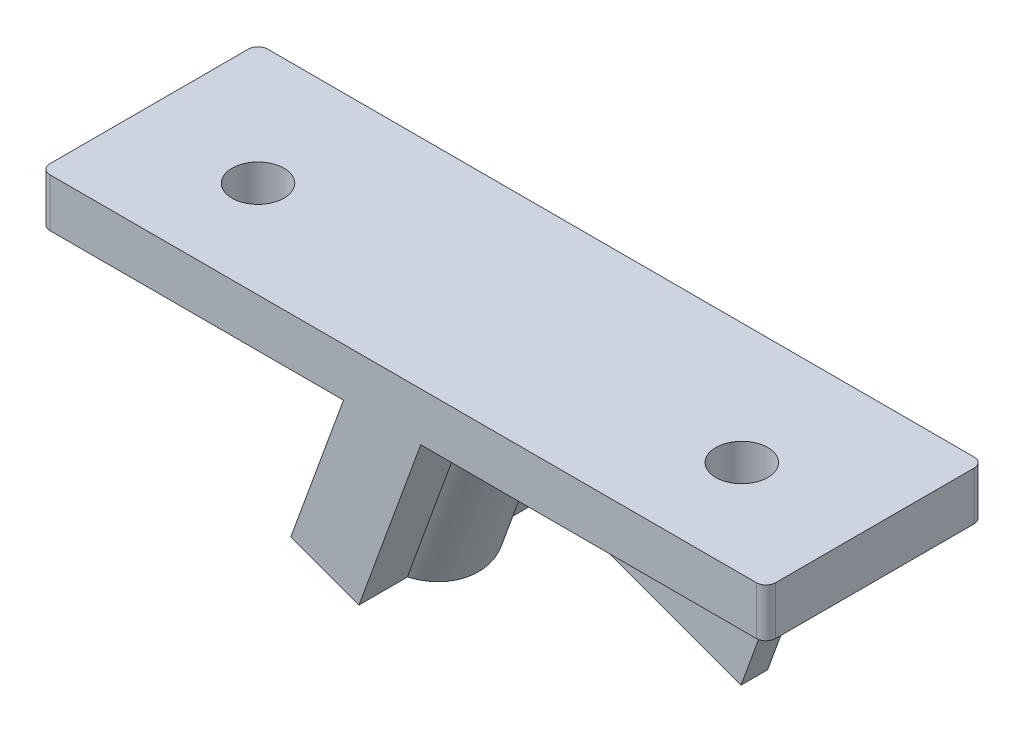
ISO-10303-21;
HEADER;
FILE_DESCRIPTION(('STEP AP214'),'2;1');
FILE_NAME('part.step','',(''),(''),'','','');
FILE_SCHEMA(('AUTOMOTIVE_DESIGN { 1 0 10303 214 1 1 1 1 }'));
ENDSEC;
DATA;
#1=APPLICATION_CONTEXT('core data for automotive mechanical design processes');
#2=APPLICATION_PROTOCOL_DEFINITION('international standard','automotive_design',2000,#1);
#3=PRODUCT_CONTEXT('',#1,'mechanical');
#4=PRODUCT('Part','Part','',(#3));
#5=PRODUCT_RELATED_PRODUCT_CATEGORY('part','',(#4));
#6=PRODUCT_DEFINITION_FORMATION('','',#4);
#7=PRODUCT_DEFINITION_CONTEXT('part definition',#1,'design');
#8=PRODUCT_DEFINITION('design','',#6,#7);
#9=PRODUCT_DEFINITION_SHAPE('','',#8);
#10=(LENGTH_UNIT() NAMED_UNIT(*) SI_UNIT(.MILLI.,.METRE.));
#11=(NAMED_UNIT(*) PLANE_ANGLE_UNIT() SI_UNIT($,.RADIAN.));
#12=(NAMED_UNIT(*) SI_UNIT($,.STERADIAN.) SOLID_ANGLE_UNIT());
#13=UNCERTAINTY_MEASURE_WITH_UNIT(LENGTH_MEASURE(1.E-05),#10,'distance_accuracy_value','');
#14=(GEOMETRIC_REPRESENTATION_CONTEXT(3) GLOBAL_UNCERTAINTY_ASSIGNED_CONTEXT((#13)) GLOBAL_UNIT_ASSIGNED_CONTEXT((#10,
#11,#12)) REPRESENTATION_CONTEXT('',''));
#15=CARTESIAN_POINT('',(0.,0.,0.));
#16=DIRECTION('',(0.,0.,1.));
#17=DIRECTION('',(1.,0.,0.));
#18=AXIS2_PLACEMENT_3D('',#15,#16,#17);
#19=CARTESIAN_POINT('',(0.,0.,0.));
#20=DIRECTION('',(0.,1.,0.));
#21=DIRECTION('',(0.,0.,1.));
#22=AXIS2_PLACEMENT_3D('',#19,#20,#21);
#23=PLANE('',#22);
#24=CARTESIAN_POINT('',(20.,0.,-8.));
#25=DIRECTION('',(0.,1.,0.));
#26=DIRECTION('',(0.,0.,1.));
#27=AXIS2_PLACEMENT_3D('',#24,#25,#26);
#28=CIRCLE('',#27,2.15);
#29=CARTESIAN_POINT('',(20.,0.,-5.85));
#30=VERTEX_POINT('',#29);
#31=EDGE_CURVE('E271',#30,#30,#28,.T.);
#32=ORIENTED_EDGE('',*,*,#31,.T.);
#33=EDGE_LOOP('',(#32));
#34=FACE_BOUND('',#33,.T.);
#35=DIRECTION('',(1.,0.,0.));
#36=VECTOR('',#35,1.);
#37=CARTESIAN_POINT('',(-30.,0.,0.));
#38=LINE('',#37,#36);
#39=CARTESIAN_POINT('',(1.45415986702924,0.,0.));
#40=VERTEX_POINT('',#39);
#41=CARTESIAN_POINT('',(29.2,0.,0.));
#42=VERTEX_POINT('',#41);
#43=EDGE_CURVE('E295',#40,#42,#38,.T.);
#44=ORIENTED_EDGE('',*,*,#43,.F.);
#45=DIRECTION('',(0.,0.,-1.));
#46=VECTOR('',#45,1.);
#47=CARTESIAN_POINT('',(1.45415986702924,0.,0.));
#48=LINE('',#47,#46);
#49=CARTESIAN_POINT('',(1.45415986702924,0.,-4.00000000000002));
#50=VERTEX_POINT('',#49);
#51=EDGE_CURVE('E232',#40,#50,#48,.T.);
#52=ORIENTED_EDGE('',*,*,#51,.T.);
#53=CARTESIAN_POINT('',(-1.73837345039849,0.,-8.00000000000002));
#54=DIRECTION('',(0.,1.,0.));
#55=DIRECTION('',(1.,0.,0.));
#56=AXIS2_PLACEMENT_3D('',#53,#54,#55);
#57=ELLIPSE('',#56,5.32088886237956,5.);
#58=CARTESIAN_POINT('',(1.45415986702925,0.,-12.));
#59=VERTEX_POINT('',#58);
#60=EDGE_CURVE('E11',#50,#59,#57,.T.);
#61=ORIENTED_EDGE('',*,*,#60,.T.);
#62=DIRECTION('',(0.,0.,-1.));
#63=VECTOR('',#62,1.);
#64=CARTESIAN_POINT('',(1.45415986702924,0.,0.));
#65=LINE('',#64,#63);
#66=CARTESIAN_POINT('',(1.45415986702928,0.,-15.8));
#67=VERTEX_POINT('',#66);
#68=EDGE_CURVE('E229',#59,#67,#65,.T.);
#69=ORIENTED_EDGE('',*,*,#68,.T.);
#70=DIRECTION('',(1.,0.,0.));
#71=VECTOR('',#70,1.);
#72=CARTESIAN_POINT('',(19.3323464446246,0.,-15.8));
#73=LINE('',#72,#71);
#74=CARTESIAN_POINT('',(19.3323464446246,0.,-15.8));
#75=VERTEX_POINT('',#74);
#76=EDGE_CURVE('E248',#67,#75,#73,.T.);
#77=ORIENTED_EDGE('',*,*,#76,.T.);
#78=DIRECTION('',(0.,0.,-1.));
#79=VECTOR('',#78,1.);
#80=CARTESIAN_POINT('',(19.3323464446246,0.,-15.8));
#81=LINE('',#80,#79);
#82=CARTESIAN_POINT('',(19.3323464446246,0.,-18.));
#83=VERTEX_POINT('',#82);
#84=EDGE_CURVE('E259',#75,#83,#81,.T.);
#85=ORIENTED_EDGE('',*,*,#84,.T.);
#86=DIRECTION('',(-1.,0.,0.));
#87=VECTOR('',#86,1.);
#88=CARTESIAN_POINT('',(-30.,0.,-18.));
#89=LINE('',#88,#87);
#90=CARTESIAN_POINT('',(29.2,0.,-18.));
#91=VERTEX_POINT('',#90);
#92=EDGE_CURVE('E284',#91,#83,#89,.T.);
#93=ORIENTED_EDGE('',*,*,#92,.F.);
#94=CARTESIAN_POINT('',(29.2,0.,-17.2));
#95=DIRECTION('',(0.,1.,0.));
#96=DIRECTION('',(0.,0.,1.));
#97=AXIS2_PLACEMENT_3D('',#94,#95,#96);
#98=CIRCLE('',#97,0.8);
#99=CARTESIAN_POINT('',(30.,0.,-17.2));
#100=VERTEX_POINT('',#99);
#101=EDGE_CURVE('E305',#91,#100,#98,.F.);
#102=ORIENTED_EDGE('',*,*,#101,.T.);
#103=DIRECTION('',(0.,0.,-1.));
#104=VECTOR('',#103,1.);
#105=CARTESIAN_POINT('',(30.,0.,-18.));
#106=LINE('',#105,#104);
#107=CARTESIAN_POINT('',(30.,0.,-0.799999999999999));
#108=VERTEX_POINT('',#107);
#109=EDGE_CURVE('E297',#108,#100,#106,.T.);
#110=ORIENTED_EDGE('',*,*,#109,.F.);
#111=CARTESIAN_POINT('',(29.2,0.,-0.799999999999999));
#112=DIRECTION('',(0.,1.,0.));
#113=DIRECTION('',(0.,0.,1.));
#114=AXIS2_PLACEMENT_3D('',#111,#112,#113);
#115=CIRCLE('',#114,0.8);
#116=EDGE_CURVE('E307',#108,#42,#115,.F.);
#117=ORIENTED_EDGE('',*,*,#116,.T.);
#118=EDGE_LOOP('',(#44,#52,#61,#69,#77,#85,#93,#102,#110,#117));
#119=FACE_BOUND('',#118,.T.);
#120=ADVANCED_FACE('F39',(#34,#119),#23,.F.);
#121=CARTESIAN_POINT('',(0.,0.,-15.8));
#122=DIRECTION('',(0.,0.,-1.));
#123=DIRECTION('',(0.,1.,0.));
#124=AXIS2_PLACEMENT_3D('',#121,#122,#123);
#125=PLANE('',#124);
#126=ORIENTED_EDGE('',*,*,#76,.F.);
#127=DIRECTION('',(-0.342020143325669,-0.939692620785908,0.));
#128=VECTOR('',#127,1.);
#129=CARTESIAN_POINT('',(1.28405547628681,-0.467357972514915,-15.8));
#130=LINE('',#129,#128);
#131=CARTESIAN_POINT('',(-3.65250134780513,-14.0304363765621,-15.8));
#132=VERTEX_POINT('',#131);
#133=EDGE_CURVE('E337',#67,#132,#130,.T.);
#134=ORIENTED_EDGE('',*,*,#133,.T.);
#135=DIRECTION('',(-0.939692620785908,0.34202014332567,0.));
#136=VECTOR('',#135,1.);
#137=CARTESIAN_POINT('',(12.1343346813981,-19.7763747844334,-15.8));
#138=LINE('',#137,#136);
#139=CARTESIAN_POINT('',(12.1343346813981,-19.7763747844334,-15.8));
#140=VERTEX_POINT('',#139);
#141=EDGE_CURVE('E243',#140,#132,#138,.T.);
#142=ORIENTED_EDGE('',*,*,#141,.F.);
#143=DIRECTION('',(-0.34202014332567,-0.939692620785908,0.));
#144=VECTOR('',#143,1.);
#145=CARTESIAN_POINT('',(19.3323464446246,0.,-15.8));
#146=LINE('',#145,#144);
#147=EDGE_CURVE('E238',#75,#140,#146,.T.);
#148=ORIENTED_EDGE('',*,*,#147,.F.);
#149=EDGE_LOOP('',(#126,#134,#142,#148));
#150=FACE_BOUND('',#149,.T.);
#151=ADVANCED_FACE('F371',(#150),#125,.F.);
#152=CARTESIAN_POINT('',(-20.,0.,-8.));
#153=DIRECTION('',(0.,1.,0.));
#154=DIRECTION('',(0.,0.,1.));
#155=AXIS2_PLACEMENT_3D('',#152,#153,#154);
#156=CIRCLE('',#155,2.15);
#157=CARTESIAN_POINT('',(-20.,0.,-5.85));
#158=VERTEX_POINT('',#157);
#159=EDGE_CURVE('E262',#158,#158,#156,.T.);
#160=ORIENTED_EDGE('',*,*,#159,.T.);
#161=EDGE_LOOP('',(#160));
#162=FACE_BOUND('',#161,.T.);
#163=CARTESIAN_POINT('',(-1.73837345039849,0.,-8.00000000000002));
#164=DIRECTION('',(0.,1.,0.));
#165=DIRECTION('',(1.,0.,0.));
#166=AXIS2_PLACEMENT_3D('',#163,#164,#165);
#167=ELLIPSE('',#166,5.32088886237956,5.);
#168=CARTESIAN_POINT('',(-4.93090676782623,0.,-12.));
#169=VERTEX_POINT('',#168);
#170=CARTESIAN_POINT('',(-4.93090676782623,0.,-4.00000000000002));
#171=VERTEX_POINT('',#170);
#172=EDGE_CURVE('E47',#169,#171,#167,.T.);
#173=ORIENTED_EDGE('',*,*,#172,.T.);
#174=DIRECTION('',(0.,0.,1.));
#175=VECTOR('',#174,1.);
#176=CARTESIAN_POINT('',(-4.93090676782623,0.,0.));
#177=LINE('',#176,#175);
#178=CARTESIAN_POINT('',(-4.93090676782623,0.,0.));
#179=VERTEX_POINT('',#178);
#180=EDGE_CURVE('E235',#171,#179,#177,.T.);
#181=ORIENTED_EDGE('',*,*,#180,.T.);
#182=CARTESIAN_POINT('',(-29.2,0.,0.));
#183=VERTEX_POINT('',#182);
#184=EDGE_CURVE('E198',#183,#179,#38,.T.);
#185=ORIENTED_EDGE('',*,*,#184,.F.);
#186=CARTESIAN_POINT('',(-29.2,0.,-0.8));
#187=DIRECTION('',(0.,1.,0.));
#188=DIRECTION('',(0.,0.,1.));
#189=AXIS2_PLACEMENT_3D('',#186,#187,#188);
#190=CIRCLE('',#189,0.8);
#191=CARTESIAN_POINT('',(-30.,0.,-0.799999999999999));
#192=VERTEX_POINT('',#191);
#193=EDGE_CURVE('E310',#183,#192,#190,.F.);
#194=ORIENTED_EDGE('',*,*,#193,.T.);
#195=DIRECTION('',(0.,0.,1.));
#196=VECTOR('',#195,1.);
#197=CARTESIAN_POINT('',(-30.,0.,-18.));
#198=LINE('',#197,#196);
#199=CARTESIAN_POINT('',(-30.,0.,-17.2));
#200=VERTEX_POINT('',#199);
#201=EDGE_CURVE('E277',#200,#192,#198,.T.);
#202=ORIENTED_EDGE('',*,*,#201,.F.);
#203=CARTESIAN_POINT('',(-29.2,0.,-17.2));
#204=DIRECTION('',(0.,1.,0.));
#205=DIRECTION('',(0.,0.,1.));
#206=AXIS2_PLACEMENT_3D('',#203,#204,#205);
#207=CIRCLE('',#206,0.8);
#208=CARTESIAN_POINT('',(-29.2,0.,-18.));
#209=VERTEX_POINT('',#208);
#210=EDGE_CURVE('E312',#200,#209,#207,.F.);
#211=ORIENTED_EDGE('',*,*,#210,.T.);
#212=CARTESIAN_POINT('',(-10.0389600757106,0.,-18.));
#213=VERTEX_POINT('',#212);
#214=EDGE_CURVE('E299',#213,#209,#89,.T.);
#215=ORIENTED_EDGE('',*,*,#214,.F.);
#216=DIRECTION('',(0.,0.,-1.));
#217=VECTOR('',#216,1.);
#218=CARTESIAN_POINT('',(-10.0389600757106,0.,-15.8));
#219=LINE('',#218,#217);
#220=CARTESIAN_POINT('',(-10.0389600757106,0.,-15.8));
#221=VERTEX_POINT('',#220);
#222=EDGE_CURVE('E263',#221,#213,#219,.T.);
#223=ORIENTED_EDGE('',*,*,#222,.F.);
#224=CARTESIAN_POINT('',(-4.9309067678262,0.,-15.8));
#225=VERTEX_POINT('',#224);
#226=EDGE_CURVE('E249',#221,#225,#73,.T.);
#227=ORIENTED_EDGE('',*,*,#226,.T.);
#228=DIRECTION('',(0.,0.,1.));
#229=VECTOR('',#228,1.);
#230=CARTESIAN_POINT('',(-4.93090676782623,0.,0.));
#231=LINE('',#230,#229);
#232=EDGE_CURVE('E54',#225,#169,#231,.T.);
#233=ORIENTED_EDGE('',*,*,#232,.T.);
#234=EDGE_LOOP('',(#173,#181,#185,#194,#202,#211,#215,#223,#227,#233));
#235=FACE_BOUND('',#234,.T.);
#236=ADVANCED_FACE('F341',(#162,#235),#23,.F.);
#237=CARTESIAN_POINT('',(0.,4.,0.));
#238=DIRECTION('',(0.,1.,0.));
#239=DIRECTION('',(0.,0.,1.));
#240=AXIS2_PLACEMENT_3D('',#237,#238,#239);
#241=PLANE('',#240);
#242=CARTESIAN_POINT('',(20.,4.,-8.));
#243=DIRECTION('',(0.,1.,0.));
#244=DIRECTION('',(0.,0.,1.));
#245=AXIS2_PLACEMENT_3D('',#242,#243,#244);
#246=CIRCLE('',#245,2.15);
#247=CARTESIAN_POINT('',(20.,4.,-5.85));
#248=VERTEX_POINT('',#247);
#249=EDGE_CURVE('E274',#248,#248,#246,.T.);
#250=ORIENTED_EDGE('',*,*,#249,.F.);
#251=EDGE_LOOP('',(#250));
#252=FACE_BOUND('',#251,.T.);
#253=DIRECTION('',(-1.,0.,0.));
#254=VECTOR('',#253,1.);
#255=CARTESIAN_POINT('',(-30.,4.,-18.));
#256=LINE('',#255,#254);
#257=CARTESIAN_POINT('',(29.2,4.,-18.));
#258=VERTEX_POINT('',#257);
#259=CARTESIAN_POINT('',(-29.2,4.,-18.));
#260=VERTEX_POINT('',#259);
#261=EDGE_CURVE('E289',#258,#260,#256,.T.);
#262=ORIENTED_EDGE('',*,*,#261,.T.);
#263=CARTESIAN_POINT('',(-29.2,4.,-17.2));
#264=DIRECTION('',(0.,1.,0.));
#265=DIRECTION('',(0.,0.,1.));
#266=AXIS2_PLACEMENT_3D('',#263,#264,#265);
#267=CIRCLE('',#266,0.8);
#268=CARTESIAN_POINT('',(-30.,4.,-17.2));
#269=VERTEX_POINT('',#268);
#270=EDGE_CURVE('E325',#260,#269,#267,.T.);
#271=ORIENTED_EDGE('',*,*,#270,.T.);
#272=DIRECTION('',(0.,0.,1.));
#273=VECTOR('',#272,1.);
#274=CARTESIAN_POINT('',(-30.,4.,-18.));
#275=LINE('',#274,#273);
#276=CARTESIAN_POINT('',(-30.,4.,-0.799999999999999));
#277=VERTEX_POINT('',#276);
#278=EDGE_CURVE('E280',#269,#277,#275,.T.);
#279=ORIENTED_EDGE('',*,*,#278,.T.);
#280=CARTESIAN_POINT('',(-29.2,4.,-0.8));
#281=DIRECTION('',(0.,1.,0.));
#282=DIRECTION('',(0.,0.,1.));
#283=AXIS2_PLACEMENT_3D('',#280,#281,#282);
#284=CIRCLE('',#283,0.8);
#285=CARTESIAN_POINT('',(-29.2,4.,0.));
#286=VERTEX_POINT('',#285);
#287=EDGE_CURVE('E323',#277,#286,#284,.T.);
#288=ORIENTED_EDGE('',*,*,#287,.T.);
#289=DIRECTION('',(1.,0.,0.));
#290=VECTOR('',#289,1.);
#291=CARTESIAN_POINT('',(-30.,4.,0.));
#292=LINE('',#291,#290);
#293=CARTESIAN_POINT('',(29.2,4.,0.));
#294=VERTEX_POINT('',#293);
#295=EDGE_CURVE('E283',#286,#294,#292,.T.);
#296=ORIENTED_EDGE('',*,*,#295,.T.);
#297=CARTESIAN_POINT('',(29.2,4.,-0.799999999999999));
#298=DIRECTION('',(0.,1.,0.));
#299=DIRECTION('',(0.,0.,1.));
#300=AXIS2_PLACEMENT_3D('',#297,#298,#299);
#301=CIRCLE('',#300,0.8);
#302=CARTESIAN_POINT('',(30.,4.,-0.799999999999999));
#303=VERTEX_POINT('',#302);
#304=EDGE_CURVE('E321',#294,#303,#301,.T.);
#305=ORIENTED_EDGE('',*,*,#304,.T.);
#306=DIRECTION('',(0.,0.,-1.));
#307=VECTOR('',#306,1.);
#308=CARTESIAN_POINT('',(30.,4.,-18.));
#309=LINE('',#308,#307);
#310=CARTESIAN_POINT('',(30.,4.,-17.2));
#311=VERTEX_POINT('',#310);
#312=EDGE_CURVE('E287',#303,#311,#309,.T.);
#313=ORIENTED_EDGE('',*,*,#312,.T.);
#314=CARTESIAN_POINT('',(29.2,4.,-17.2));
#315=DIRECTION('',(0.,1.,0.));
#316=DIRECTION('',(0.,0.,1.));
#317=AXIS2_PLACEMENT_3D('',#314,#315,#316);
#318=CIRCLE('',#317,0.8);
#319=EDGE_CURVE('E319',#311,#258,#318,.T.);
#320=ORIENTED_EDGE('',*,*,#319,.T.);
#321=EDGE_LOOP('',(#262,#271,#279,#288,#296,#305,#313,#320));
#322=FACE_BOUND('',#321,.T.);
#323=CARTESIAN_POINT('',(-20.,4.,-8.));
#324=DIRECTION('',(0.,1.,0.));
#325=DIRECTION('',(0.,0.,1.));
#326=AXIS2_PLACEMENT_3D('',#323,#324,#325);
#327=CIRCLE('',#326,2.15);
#328=CARTESIAN_POINT('',(-20.,4.,-5.85));
#329=VERTEX_POINT('',#328);
#330=EDGE_CURVE('E268',#329,#329,#327,.T.);
#331=ORIENTED_EDGE('',*,*,#330,.F.);
#332=EDGE_LOOP('',(#331));
#333=FACE_BOUND('',#332,.T.);
#334=ADVANCED_FACE('F389',(#252,#322,#333),#241,.T.);
#335=CARTESIAN_POINT('',(-30.,4.,-18.));
#336=DIRECTION('',(1.,0.,0.));
#337=DIRECTION('',(0.,0.,-1.));
#338=AXIS2_PLACEMENT_3D('',#335,#336,#337);
#339=PLANE('',#338);
#340=ORIENTED_EDGE('',*,*,#278,.F.);
#341=DIRECTION('',(0.,-1.,0.));
#342=VECTOR('',#341,1.);
#343=CARTESIAN_POINT('',(-30.,4.,-17.2));
#344=LINE('',#343,#342);
#345=EDGE_CURVE('E302',#269,#200,#344,.T.);
#346=ORIENTED_EDGE('',*,*,#345,.T.);
#347=ORIENTED_EDGE('',*,*,#201,.T.);
#348=DIRECTION('',(0.,-1.,0.));
#349=VECTOR('',#348,1.);
#350=CARTESIAN_POINT('',(-30.,4.,-0.799999999999999));
#351=LINE('',#350,#349);
#352=EDGE_CURVE('E292',#192,#277,#351,.F.);
#353=ORIENTED_EDGE('',*,*,#352,.T.);
#354=EDGE_LOOP('',(#340,#346,#347,#353));
#355=FACE_BOUND('',#354,.T.);
#356=ADVANCED_FACE('F398',(#355),#339,.F.);
#357=CARTESIAN_POINT('',(-30.,4.,0.));
#358=DIRECTION('',(0.,0.,-1.));
#359=DIRECTION('',(-1.,0.,0.));
#360=AXIS2_PLACEMENT_3D('',#357,#358,#359);
#361=PLANE('',#360);
#362=ORIENTED_EDGE('',*,*,#184,.T.);
#363=DIRECTION('',(0.342020143325669,0.939692620785908,0.));
#364=VECTOR('',#363,1.);
#365=CARTESIAN_POINT('',(-16.3332828654175,-31.327770856261,0.));
#366=LINE('',#365,#364);
#367=CARTESIAN_POINT('',(-9.29065707252058,-11.9783155166081,0.));
#368=VERTEX_POINT('',#367);
#369=EDGE_CURVE('E192',#368,#179,#366,.T.);
#370=ORIENTED_EDGE('',*,*,#369,.F.);
#371=DIRECTION('',(0.939692620785908,-0.34202014332567,0.));
#372=VECTOR('',#371,1.);
#373=CARTESIAN_POINT('',(-9.29065707252057,-11.9783155166081,0.));
#374=LINE('',#373,#372);
#375=CARTESIAN_POINT('',(-3.65250134780513,-14.0304363765621,0.));
#376=VERTEX_POINT('',#375);
#377=EDGE_CURVE('E178',#368,#376,#374,.T.);
#378=ORIENTED_EDGE('',*,*,#377,.T.);
#379=DIRECTION('',(0.342020143325669,0.939692620785908,0.));
#380=VECTOR('',#379,1.);
#381=CARTESIAN_POINT('',(-10.6951271407021,-33.3798917162151,0.));
#382=LINE('',#381,#380);
#383=EDGE_CURVE('E191',#376,#40,#382,.T.);
#384=ORIENTED_EDGE('',*,*,#383,.T.);
#385=ORIENTED_EDGE('',*,*,#43,.T.);
#386=DIRECTION('',(0.,-1.,0.));
#387=VECTOR('',#386,1.);
#388=CARTESIAN_POINT('',(29.2,4.,0.));
#389=LINE('',#388,#387);
#390=EDGE_CURVE('E327',#42,#294,#389,.F.);
#391=ORIENTED_EDGE('',*,*,#390,.T.);
#392=ORIENTED_EDGE('',*,*,#295,.F.);
#393=DIRECTION('',(0.,-1.,0.));
#394=VECTOR('',#393,1.);
#395=CARTESIAN_POINT('',(-29.2,4.,0.));
#396=LINE('',#395,#394);
#397=EDGE_CURVE('E329',#286,#183,#396,.T.);
#398=ORIENTED_EDGE('',*,*,#397,.T.);
#399=EDGE_LOOP('',(#362,#370,#378,#384,#385,#391,#392,#398));
#400=FACE_BOUND('',#399,.T.);
#401=ADVANCED_FACE('F195',(#400),#361,.F.);
#402=CARTESIAN_POINT('',(30.,4.,-18.));
#403=DIRECTION('',(-1.,0.,0.));
#404=DIRECTION('',(0.,0.,1.));
#405=AXIS2_PLACEMENT_3D('',#402,#403,#404);
#406=PLANE('',#405);
#407=ORIENTED_EDGE('',*,*,#312,.F.);
#408=DIRECTION('',(0.,-1.,0.));
#409=VECTOR('',#408,1.);
#410=CARTESIAN_POINT('',(30.,4.,-0.799999999999999));
#411=LINE('',#410,#409);
#412=EDGE_CURVE('E332',#303,#108,#411,.T.);
#413=ORIENTED_EDGE('',*,*,#412,.T.);
#414=ORIENTED_EDGE('',*,*,#109,.T.);
#415=DIRECTION('',(0.,-1.,0.));
#416=VECTOR('',#415,1.);
#417=CARTESIAN_POINT('',(30.,4.,-17.2));
#418=LINE('',#417,#416);
#419=EDGE_CURVE('E62',#100,#311,#418,.F.);
#420=ORIENTED_EDGE('',*,*,#419,.T.);
#421=EDGE_LOOP('',(#407,#413,#414,#420));
#422=FACE_BOUND('',#421,.T.);
#423=ADVANCED_FACE('F410',(#422),#406,.F.);
#424=CARTESIAN_POINT('',(-30.,4.,-18.));
#425=DIRECTION('',(0.,0.,1.));
#426=DIRECTION('',(1.,0.,0.));
#427=AXIS2_PLACEMENT_3D('',#424,#425,#426);
#428=PLANE('',#427);
#429=DIRECTION('',(-0.939692620785908,0.34202014332567,0.));
#430=VECTOR('',#429,1.);
#431=CARTESIAN_POINT('',(12.1343346813981,-19.7763747844334,-18.));
#432=LINE('',#431,#430);
#433=CARTESIAN_POINT('',(12.1343346813981,-19.7763747844334,-18.));
#434=VERTEX_POINT('',#433);
#435=CARTESIAN_POINT('',(-13.8011816522929,-10.3366188286449,-18.));
#436=VERTEX_POINT('',#435);
#437=EDGE_CURVE('E255',#434,#436,#432,.T.);
#438=ORIENTED_EDGE('',*,*,#437,.T.);
#439=DIRECTION('',(0.34202014332567,0.939692620785908,0.));
#440=VECTOR('',#439,1.);
#441=CARTESIAN_POINT('',(-10.0389600757106,0.,-18.));
#442=LINE('',#441,#440);
#443=EDGE_CURVE('E242',#436,#213,#442,.T.);
#444=ORIENTED_EDGE('',*,*,#443,.T.);
#445=ORIENTED_EDGE('',*,*,#214,.T.);
#446=DIRECTION('',(0.,-1.,0.));
#447=VECTOR('',#446,1.);
#448=CARTESIAN_POINT('',(-29.2,4.,-18.));
#449=LINE('',#448,#447);
#450=EDGE_CURVE('E317',#209,#260,#449,.F.);
#451=ORIENTED_EDGE('',*,*,#450,.T.);
#452=ORIENTED_EDGE('',*,*,#261,.F.);
#453=DIRECTION('',(0.,-1.,0.));
#454=VECTOR('',#453,1.);
#455=CARTESIAN_POINT('',(29.2,4.,-18.));
#456=LINE('',#455,#454);
#457=EDGE_CURVE('E314',#258,#91,#456,.T.);
#458=ORIENTED_EDGE('',*,*,#457,.T.);
#459=ORIENTED_EDGE('',*,*,#92,.T.);
#460=DIRECTION('',(-0.34202014332567,-0.939692620785908,0.));
#461=VECTOR('',#460,1.);
#462=CARTESIAN_POINT('',(19.3323464446246,0.,-18.));
#463=LINE('',#462,#461);
#464=EDGE_CURVE('E237',#83,#434,#463,.T.);
#465=ORIENTED_EDGE('',*,*,#464,.T.);
#466=EDGE_LOOP('',(#438,#444,#445,#451,#452,#458,#459,#465));
#467=FACE_BOUND('',#466,.T.);
#468=ADVANCED_FACE('F361',(#467),#428,.F.);
#469=CARTESIAN_POINT('',(20.,4.,-8.));
#470=DIRECTION('',(0.,-1.,0.));
#471=DIRECTION('',(0.,0.,-1.));
#472=AXIS2_PLACEMENT_3D('',#469,#470,#471);
#473=CYLINDRICAL_SURFACE('',#472,2.15);
#474=ORIENTED_EDGE('',*,*,#249,.T.);
#475=EDGE_LOOP('',(#474));
#476=FACE_BOUND('',#475,.T.);
#477=ORIENTED_EDGE('',*,*,#31,.F.);
#478=EDGE_LOOP('',(#477));
#479=FACE_BOUND('',#478,.T.);
#480=ADVANCED_FACE('F417',(#476,#479),#473,.F.);
#481=CARTESIAN_POINT('',(-20.,4.,-8.));
#482=DIRECTION('',(0.,-1.,0.));
#483=DIRECTION('',(0.,0.,-1.));
#484=AXIS2_PLACEMENT_3D('',#481,#482,#483);
#485=CYLINDRICAL_SURFACE('',#484,2.15);
#486=ORIENTED_EDGE('',*,*,#330,.T.);
#487=EDGE_LOOP('',(#486));
#488=FACE_BOUND('',#487,.T.);
#489=ORIENTED_EDGE('',*,*,#159,.F.);
#490=EDGE_LOOP('',(#489));
#491=FACE_BOUND('',#490,.T.);
#492=ADVANCED_FACE('F436',(#488,#491),#485,.F.);
#493=CARTESIAN_POINT('',(19.3323464446246,0.,-15.8));
#494=DIRECTION('',(0.939692620785908,-0.34202014332567,0.));
#495=DIRECTION('',(0.34202014332567,0.939692620785908,0.));
#496=AXIS2_PLACEMENT_3D('',#493,#494,#495);
#497=PLANE('',#496);
#498=ORIENTED_EDGE('',*,*,#464,.F.);
#499=ORIENTED_EDGE('',*,*,#84,.F.);
#500=ORIENTED_EDGE('',*,*,#147,.T.);
#501=DIRECTION('',(0.,0.,-1.));
#502=VECTOR('',#501,1.);
#503=CARTESIAN_POINT('',(12.1343346813981,-19.7763747844334,-15.8));
#504=LINE('',#503,#502);
#505=EDGE_CURVE('E252',#140,#434,#504,.T.);
#506=ORIENTED_EDGE('',*,*,#505,.T.);
#507=EDGE_LOOP('',(#498,#499,#500,#506));
#508=FACE_BOUND('',#507,.T.);
#509=ADVANCED_FACE('F365',(#508),#497,.T.);
#510=CARTESIAN_POINT('',(-10.0389600757106,0.,-15.8));
#511=DIRECTION('',(-0.939692620785908,0.34202014332567,0.));
#512=DIRECTION('',(-0.34202014332567,-0.939692620785908,0.));
#513=AXIS2_PLACEMENT_3D('',#510,#511,#512);
#514=PLANE('',#513);
#515=ORIENTED_EDGE('',*,*,#443,.F.);
#516=DIRECTION('',(0.,0.,-1.));
#517=VECTOR('',#516,1.);
#518=CARTESIAN_POINT('',(-13.8011816522929,-10.3366188286449,-15.8));
#519=LINE('',#518,#517);
#520=CARTESIAN_POINT('',(-13.8011816522929,-10.3366188286449,-15.8));
#521=VERTEX_POINT('',#520);
#522=EDGE_CURVE('E265',#521,#436,#519,.T.);
#523=ORIENTED_EDGE('',*,*,#522,.F.);
#524=DIRECTION('',(0.34202014332567,0.939692620785908,0.));
#525=VECTOR('',#524,1.);
#526=CARTESIAN_POINT('',(-10.0389600757106,0.,-15.8));
#527=LINE('',#526,#525);
#528=EDGE_CURVE('E246',#521,#221,#527,.T.);
#529=ORIENTED_EDGE('',*,*,#528,.T.);
#530=ORIENTED_EDGE('',*,*,#222,.T.);
#531=EDGE_LOOP('',(#515,#523,#529,#530));
#532=FACE_BOUND('',#531,.T.);
#533=ADVANCED_FACE('F356',(#532),#514,.T.);
#534=CARTESIAN_POINT('',(12.1343346813981,-19.7763747844334,-15.8));
#535=DIRECTION('',(-0.34202014332567,-0.939692620785908,0.));
#536=DIRECTION('',(0.939692620785908,-0.34202014332567,0.));
#537=AXIS2_PLACEMENT_3D('',#534,#535,#536);
#538=PLANE('',#537);
#539=ORIENTED_EDGE('',*,*,#522,.T.);
#540=ORIENTED_EDGE('',*,*,#437,.F.);
#541=ORIENTED_EDGE('',*,*,#505,.F.);
#542=ORIENTED_EDGE('',*,*,#141,.T.);
#543=DIRECTION('',(0.,0.,-1.));
#544=VECTOR('',#543,1.);
#545=CARTESIAN_POINT('',(-3.65250134780513,-14.0304363765621,-12.));
#546=LINE('',#545,#544);
#547=CARTESIAN_POINT('',(-3.65250134780513,-14.0304363765621,-12.));
#548=VERTEX_POINT('',#547);
#549=EDGE_CURVE('E213',#548,#132,#546,.T.);
#550=ORIENTED_EDGE('',*,*,#549,.F.);
#551=CARTESIAN_POINT('',(-6.47157921016286,-13.0043759465851,-8.00000000000002));
#552=DIRECTION('',(-0.34202014332567,-0.939692620785908,0.));
#553=DIRECTION('',(0.939692620785908,-0.34202014332567,0.));
#554=AXIS2_PLACEMENT_3D('',#551,#552,#553);
#555=CIRCLE('',#554,5.);
#556=CARTESIAN_POINT('',(-3.65250134780513,-14.0304363765621,-4.00000000000002));
#557=VERTEX_POINT('',#556);
#558=EDGE_CURVE('E216',#557,#548,#555,.F.);
#559=ORIENTED_EDGE('',*,*,#558,.F.);
#560=DIRECTION('',(0.,0.,-1.));
#561=VECTOR('',#560,1.);
#562=CARTESIAN_POINT('',(-3.65250134780513,-14.0304363765621,0.));
#563=LINE('',#562,#561);
#564=EDGE_CURVE('E187',#376,#557,#563,.T.);
#565=ORIENTED_EDGE('',*,*,#564,.F.);
#566=ORIENTED_EDGE('',*,*,#377,.F.);
#567=DIRECTION('',(0.,0.,1.));
#568=VECTOR('',#567,1.);
#569=CARTESIAN_POINT('',(-9.29065707252058,-11.9783155166081,0.));
#570=LINE('',#569,#568);
#571=CARTESIAN_POINT('',(-9.29065707252058,-11.9783155166081,-4.00000000000002));
#572=VERTEX_POINT('',#571);
#573=EDGE_CURVE('E184',#572,#368,#570,.T.);
#574=ORIENTED_EDGE('',*,*,#573,.F.);
#575=CARTESIAN_POINT('',(-6.47157921016286,-13.0043759465851,-8.00000000000002));
#576=DIRECTION('',(-0.34202014332567,-0.939692620785908,0.));
#577=DIRECTION('',(0.939692620785908,-0.34202014332567,0.));
#578=AXIS2_PLACEMENT_3D('',#575,#576,#577);
#579=CIRCLE('',#578,5.);
#580=CARTESIAN_POINT('',(-9.29065707252058,-11.9783155166081,-12.));
#581=VERTEX_POINT('',#580);
#582=EDGE_CURVE('E208',#581,#572,#579,.F.);
#583=ORIENTED_EDGE('',*,*,#582,.F.);
#584=DIRECTION('',(0.,0.,1.));
#585=VECTOR('',#584,1.);
#586=CARTESIAN_POINT('',(-9.29065707252058,-11.9783155166081,-12.));
#587=LINE('',#586,#585);
#588=CARTESIAN_POINT('',(-9.29065707252058,-11.9783155166081,-15.8));
#589=VERTEX_POINT('',#588);
#590=EDGE_CURVE('E211',#589,#581,#587,.T.);
#591=ORIENTED_EDGE('',*,*,#590,.F.);
#592=EDGE_CURVE('E241',#589,#521,#138,.T.);
#593=ORIENTED_EDGE('',*,*,#592,.T.);
#594=EDGE_LOOP('',(#539,#540,#541,#542,#550,#559,#565,#566,#574,#583,#591,#593));
#595=FACE_BOUND('',#594,.T.);
#596=ADVANCED_FACE('F181',(#595),#538,.T.);
#597=ORIENTED_EDGE('',*,*,#592,.F.);
#598=DIRECTION('',(0.342020143325669,0.939692620785908,0.));
#599=VECTOR('',#598,1.);
#600=CARTESIAN_POINT('',(-4.35410024842864,1.5847628874391,-15.8));
#601=LINE('',#600,#599);
#602=EDGE_CURVE('E335',#589,#225,#601,.T.);
#603=ORIENTED_EDGE('',*,*,#602,.T.);
#604=ORIENTED_EDGE('',*,*,#226,.F.);
#605=ORIENTED_EDGE('',*,*,#528,.F.);
#606=EDGE_LOOP('',(#597,#603,#604,#605));
#607=FACE_BOUND('',#606,.T.);
#608=ADVANCED_FACE('F351',(#607),#125,.F.);
#609=CARTESIAN_POINT('',(-29.2,4.,-17.2));
#610=DIRECTION('',(0.,-1.,0.));
#611=DIRECTION('',(0.,0.,-1.));
#612=AXIS2_PLACEMENT_3D('',#609,#610,#611);
#613=CYLINDRICAL_SURFACE('',#612,0.8);
#614=ORIENTED_EDGE('',*,*,#270,.F.);
#615=ORIENTED_EDGE('',*,*,#450,.F.);
#616=ORIENTED_EDGE('',*,*,#210,.F.);
#617=ORIENTED_EDGE('',*,*,#345,.F.);
#618=EDGE_LOOP('',(#614,#615,#616,#617));
#619=FACE_BOUND('',#618,.T.);
#620=ADVANCED_FACE('F402',(#619),#613,.T.);
#621=CARTESIAN_POINT('',(-29.2,4.,-0.8));
#622=DIRECTION('',(0.,-1.,0.));
#623=DIRECTION('',(0.,0.,-1.));
#624=AXIS2_PLACEMENT_3D('',#621,#622,#623);
#625=CYLINDRICAL_SURFACE('',#624,0.8);
#626=ORIENTED_EDGE('',*,*,#287,.F.);
#627=ORIENTED_EDGE('',*,*,#352,.F.);
#628=ORIENTED_EDGE('',*,*,#193,.F.);
#629=ORIENTED_EDGE('',*,*,#397,.F.);
#630=EDGE_LOOP('',(#626,#627,#628,#629));
#631=FACE_BOUND('',#630,.T.);
#632=ADVANCED_FACE('F395',(#631),#625,.T.);
#633=CARTESIAN_POINT('',(29.2,4.,-0.799999999999999));
#634=DIRECTION('',(0.,-1.,0.));
#635=DIRECTION('',(0.,0.,-1.));
#636=AXIS2_PLACEMENT_3D('',#633,#634,#635);
#637=CYLINDRICAL_SURFACE('',#636,0.8);
#638=ORIENTED_EDGE('',*,*,#304,.F.);
#639=ORIENTED_EDGE('',*,*,#390,.F.);
#640=ORIENTED_EDGE('',*,*,#116,.F.);
#641=ORIENTED_EDGE('',*,*,#412,.F.);
#642=EDGE_LOOP('',(#638,#639,#640,#641));
#643=FACE_BOUND('',#642,.T.);
#644=ADVANCED_FACE('F385',(#643),#637,.T.);
#645=CARTESIAN_POINT('',(29.2,4.,-17.2));
#646=DIRECTION('',(0.,-1.,0.));
#647=DIRECTION('',(0.,0.,-1.));
#648=AXIS2_PLACEMENT_3D('',#645,#646,#647);
#649=CYLINDRICAL_SURFACE('',#648,0.8);
#650=ORIENTED_EDGE('',*,*,#319,.F.);
#651=ORIENTED_EDGE('',*,*,#419,.F.);
#652=ORIENTED_EDGE('',*,*,#101,.F.);
#653=ORIENTED_EDGE('',*,*,#457,.F.);
#654=EDGE_LOOP('',(#650,#651,#652,#653));
#655=FACE_BOUND('',#654,.T.);
#656=ADVANCED_FACE('F41',(#655),#649,.T.);
#657=CARTESIAN_POINT('',(-13.5142050030598,-32.3538312862381,-8.00000000000002));
#658=DIRECTION('',(0.342020143325669,0.939692620785908,0.));
#659=DIRECTION('',(-0.939692620785908,0.342020143325669,0.));
#660=AXIS2_PLACEMENT_3D('',#657,#658,#659);
#661=CYLINDRICAL_SURFACE('',#660,5.);
#662=ORIENTED_EDGE('',*,*,#60,.F.);
#663=DIRECTION('',(0.342020143325669,0.939692620785908,0.));
#664=VECTOR('',#663,1.);
#665=CARTESIAN_POINT('',(-10.6951271407021,-33.3798917162151,-4.00000000000002));
#666=LINE('',#665,#664);
#667=EDGE_CURVE('E219',#557,#50,#666,.T.);
#668=ORIENTED_EDGE('',*,*,#667,.F.);
#669=ORIENTED_EDGE('',*,*,#558,.T.);
#670=DIRECTION('',(0.342020143325669,0.939692620785908,0.));
#671=VECTOR('',#670,1.);
#672=CARTESIAN_POINT('',(-10.695127140702,-33.3798917162151,-12.));
#673=LINE('',#672,#671);
#674=EDGE_CURVE('E215',#548,#59,#673,.T.);
#675=ORIENTED_EDGE('',*,*,#674,.T.);
#676=EDGE_LOOP('',(#662,#668,#669,#675));
#677=FACE_BOUND('',#676,.T.);
#678=ADVANCED_FACE('F377',(#677),#661,.T.);
#679=CARTESIAN_POINT('',(-13.5142050030598,-32.3538312862381,-8.00000000000002));
#680=DIRECTION('',(0.342020143325669,0.939692620785908,0.));
#681=DIRECTION('',(-0.939692620785908,0.342020143325669,0.));
#682=AXIS2_PLACEMENT_3D('',#679,#680,#681);
#683=CYLINDRICAL_SURFACE('',#682,5.);
#684=ORIENTED_EDGE('',*,*,#172,.F.);
#685=DIRECTION('',(0.342020143325669,0.939692620785908,0.));
#686=VECTOR('',#685,1.);
#687=CARTESIAN_POINT('',(-16.3332828654175,-31.327770856261,-12.));
#688=LINE('',#687,#686);
#689=EDGE_CURVE('E210',#581,#169,#688,.T.);
#690=ORIENTED_EDGE('',*,*,#689,.F.);
#691=ORIENTED_EDGE('',*,*,#582,.T.);
#692=DIRECTION('',(0.342020143325669,0.939692620785908,0.));
#693=VECTOR('',#692,1.);
#694=CARTESIAN_POINT('',(-16.3332828654175,-31.327770856261,-4.00000000000002));
#695=LINE('',#694,#693);
#696=EDGE_CURVE('E205',#572,#171,#695,.T.);
#697=ORIENTED_EDGE('',*,*,#696,.T.);
#698=EDGE_LOOP('',(#684,#690,#691,#697));
#699=FACE_BOUND('',#698,.T.);
#700=ADVANCED_FACE('F344',(#699),#683,.T.);
#701=CARTESIAN_POINT('',(-16.3332828654175,-31.327770856261,0.));
#702=DIRECTION('',(-0.939692620785908,0.342020143325669,0.));
#703=DIRECTION('',(-0.342020143325669,-0.939692620785908,0.));
#704=AXIS2_PLACEMENT_3D('',#701,#702,#703);
#705=PLANE('',#704);
#706=ORIENTED_EDGE('',*,*,#180,.F.);
#707=ORIENTED_EDGE('',*,*,#696,.F.);
#708=ORIENTED_EDGE('',*,*,#573,.T.);
#709=ORIENTED_EDGE('',*,*,#369,.T.);
#710=EDGE_LOOP('',(#706,#707,#708,#709));
#711=FACE_BOUND('',#710,.T.);
#712=ADVANCED_FACE('F203',(#711),#705,.T.);
#713=CARTESIAN_POINT('',(-10.6951271407021,-33.3798917162151,0.));
#714=DIRECTION('',(0.939692620785908,-0.342020143325669,0.));
#715=DIRECTION('',(0.342020143325669,0.939692620785908,0.));
#716=AXIS2_PLACEMENT_3D('',#713,#714,#715);
#717=PLANE('',#716);
#718=ORIENTED_EDGE('',*,*,#51,.F.);
#719=ORIENTED_EDGE('',*,*,#383,.F.);
#720=ORIENTED_EDGE('',*,*,#564,.T.);
#721=ORIENTED_EDGE('',*,*,#667,.T.);
#722=EDGE_LOOP('',(#718,#719,#720,#721));
#723=FACE_BOUND('',#722,.T.);
#724=ADVANCED_FACE('F379',(#723),#717,.T.);
#725=CARTESIAN_POINT('',(-10.695127140702,-33.3798917162151,-12.));
#726=DIRECTION('',(0.939692620785908,-0.342020143325669,0.));
#727=DIRECTION('',(0.342020143325669,0.939692620785908,0.));
#728=AXIS2_PLACEMENT_3D('',#725,#726,#727);
#729=PLANE('',#728);
#730=ORIENTED_EDGE('',*,*,#68,.F.);
#731=ORIENTED_EDGE('',*,*,#674,.F.);
#732=ORIENTED_EDGE('',*,*,#549,.T.);
#733=ORIENTED_EDGE('',*,*,#133,.F.);
#734=EDGE_LOOP('',(#730,#731,#732,#733));
#735=FACE_BOUND('',#734,.T.);
#736=ADVANCED_FACE('F375',(#735),#729,.T.);
#737=CARTESIAN_POINT('',(-16.3332828654175,-31.327770856261,-12.));
#738=DIRECTION('',(-0.939692620785908,0.342020143325669,0.));
#739=DIRECTION('',(-0.342020143325669,-0.939692620785908,0.));
#740=AXIS2_PLACEMENT_3D('',#737,#738,#739);
#741=PLANE('',#740);
#742=ORIENTED_EDGE('',*,*,#232,.F.);
#743=ORIENTED_EDGE('',*,*,#602,.F.);
#744=ORIENTED_EDGE('',*,*,#590,.T.);
#745=ORIENTED_EDGE('',*,*,#689,.T.);
#746=EDGE_LOOP('',(#742,#743,#744,#745));
#747=FACE_BOUND('',#746,.T.);
#748=ADVANCED_FACE('F345',(#747),#741,.T.);
#749=CLOSED_SHELL('',(#120,#151,#236,#334,#356,#401,#423,#468,#480,#492,#509,#533,#596,#608,
#620,#632,#644,#656,#678,#700,#712,#724,#736,#748));
#750=MANIFOLD_SOLID_BREP('B2',#749);
#751=ADVANCED_BREP_SHAPE_REPRESENTATION('',(#18,#750),#14);
#752=SHAPE_DEFINITION_REPRESENTATION(#9,#751);
ENDSEC;
END-ISO-10303-21;
